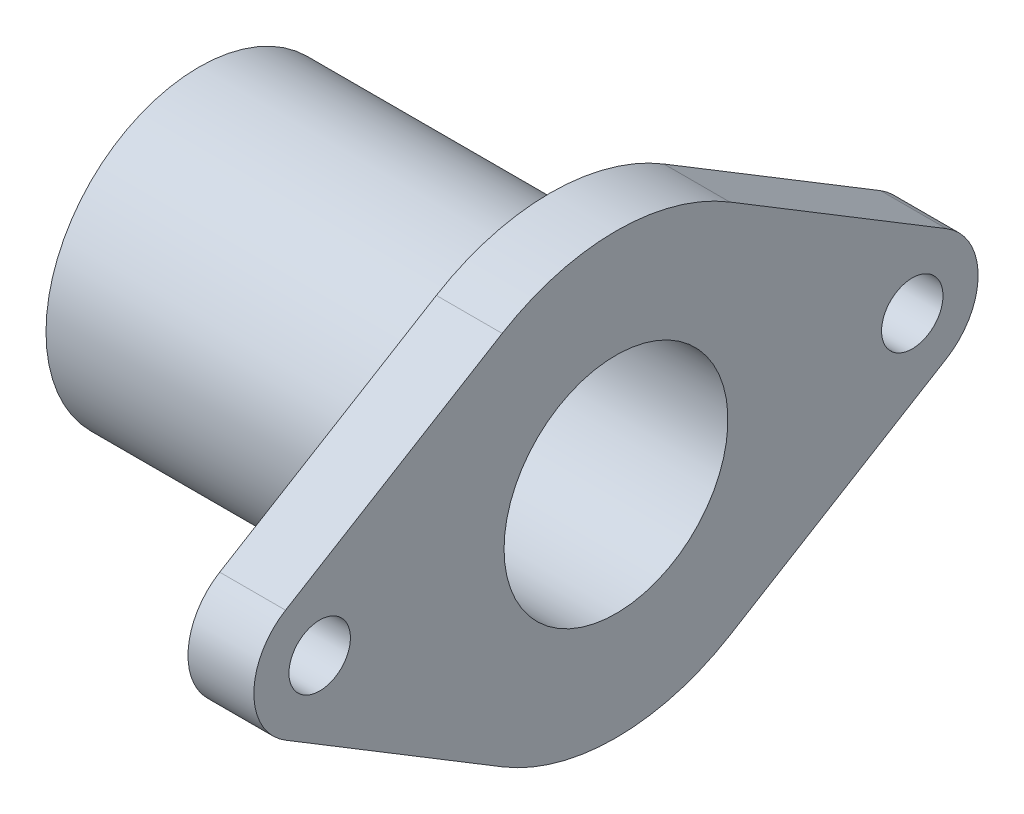
ISO-10303-21;
HEADER;
FILE_DESCRIPTION(('STEP AP214'),'2;1');
FILE_NAME('part.step','',(''),(''),'','','');
FILE_SCHEMA(('AUTOMOTIVE_DESIGN { 1 0 10303 214 1 1 1 1 }'));
ENDSEC;
DATA;
#1=APPLICATION_CONTEXT('core data for automotive mechanical design processes');
#2=APPLICATION_PROTOCOL_DEFINITION('international standard','automotive_design',2000,#1);
#3=PRODUCT_CONTEXT('',#1,'mechanical');
#4=PRODUCT('Part','Part','',(#3));
#5=PRODUCT_RELATED_PRODUCT_CATEGORY('part','',(#4));
#6=PRODUCT_DEFINITION_FORMATION('','',#4);
#7=PRODUCT_DEFINITION_CONTEXT('part definition',#1,'design');
#8=PRODUCT_DEFINITION('design','',#6,#7);
#9=PRODUCT_DEFINITION_SHAPE('','',#8);
#10=(LENGTH_UNIT() NAMED_UNIT(*) SI_UNIT(.MILLI.,.METRE.));
#11=(NAMED_UNIT(*) PLANE_ANGLE_UNIT() SI_UNIT($,.RADIAN.));
#12=(NAMED_UNIT(*) SI_UNIT($,.STERADIAN.) SOLID_ANGLE_UNIT());
#13=UNCERTAINTY_MEASURE_WITH_UNIT(LENGTH_MEASURE(1.E-05),#10,'distance_accuracy_value','');
#14=(GEOMETRIC_REPRESENTATION_CONTEXT(3) GLOBAL_UNCERTAINTY_ASSIGNED_CONTEXT((#13)) GLOBAL_UNIT_ASSIGNED_CONTEXT((#10,
#11,#12)) REPRESENTATION_CONTEXT('',''));
#15=CARTESIAN_POINT('',(0.,0.,0.));
#16=DIRECTION('',(0.,0.,1.));
#17=DIRECTION('',(1.,0.,0.));
#18=AXIS2_PLACEMENT_3D('',#15,#16,#17);
#19=CARTESIAN_POINT('',(0.,0.,0.));
#20=DIRECTION('',(1.,0.,0.));
#21=DIRECTION('',(0.,0.,-1.));
#22=AXIS2_PLACEMENT_3D('',#19,#20,#21);
#23=PLANE('',#22);
#24=CARTESIAN_POINT('',(0.,0.,0.));
#25=DIRECTION('',(1.,0.,0.));
#26=DIRECTION('',(0.,0.,-1.));
#27=AXIS2_PLACEMENT_3D('',#24,#25,#26);
#28=CIRCLE('',#27,41.85);
#29=CARTESIAN_POINT('',(0.,0.,-41.85));
#30=VERTEX_POINT('',#29);
#31=EDGE_CURVE('E251',#30,#30,#28,.T.);
#32=ORIENTED_EDGE('',*,*,#31,.T.);
#33=EDGE_LOOP('',(#32));
#34=FACE_BOUND('',#33,.T.);
#35=CARTESIAN_POINT('',(0.,0.,0.));
#36=DIRECTION('',(1.,0.,0.));
#37=DIRECTION('',(0.,0.,-1.));
#38=AXIS2_PLACEMENT_3D('',#35,#36,#37);
#39=CIRCLE('',#38,50.);
#40=CARTESIAN_POINT('',(0.,42.7533199282044,-25.9259259259259));
#41=VERTEX_POINT('',#40);
#42=CARTESIAN_POINT('',(0.,42.7533199282044,25.9259259259259));
#43=VERTEX_POINT('',#42);
#44=EDGE_CURVE('E153',#41,#43,#39,.T.);
#45=ORIENTED_EDGE('',*,*,#44,.F.);
#46=DIRECTION('',(0.,0.518518518518521,0.855066398564089));
#47=VECTOR('',#46,1.);
#48=CARTESIAN_POINT('',(0.,42.7533199282044,-25.9259259259259));
#49=LINE('',#48,#47);
#50=CARTESIAN_POINT('',(0.,12.8259959784613,-75.2777777777778));
#51=VERTEX_POINT('',#50);
#52=EDGE_CURVE('E104',#51,#41,#49,.T.);
#53=ORIENTED_EDGE('',*,*,#52,.F.);
#54=CARTESIAN_POINT('',(0.,0.,-67.5));
#55=DIRECTION('',(1.,0.,0.));
#56=DIRECTION('',(0.,0.,-1.));
#57=AXIS2_PLACEMENT_3D('',#54,#55,#56);
#58=CIRCLE('',#57,15.);
#59=CARTESIAN_POINT('',(0.,-12.8259959784613,-75.2777777777778));
#60=VERTEX_POINT('',#59);
#61=EDGE_CURVE('E98',#60,#51,#58,.T.);
#62=ORIENTED_EDGE('',*,*,#61,.F.);
#63=DIRECTION('',(0.,0.518518518518521,-0.855066398564089));
#64=VECTOR('',#63,1.);
#65=CARTESIAN_POINT('',(0.,-12.8259959784613,-75.2777777777778));
#66=LINE('',#65,#64);
#67=CARTESIAN_POINT('',(5.55111512312578E-13,-42.7533199282045,-25.9259259259259));
#68=VERTEX_POINT('',#67);
#69=EDGE_CURVE('E140',#68,#60,#66,.T.);
#70=ORIENTED_EDGE('',*,*,#69,.F.);
#71=CARTESIAN_POINT('',(0.,0.,0.));
#72=DIRECTION('',(1.,0.,0.));
#73=DIRECTION('',(0.,0.,-1.));
#74=AXIS2_PLACEMENT_3D('',#71,#72,#73);
#75=CIRCLE('',#74,50.);
#76=CARTESIAN_POINT('',(5.55111512312578E-13,-42.7533199282045,25.9259259259259));
#77=VERTEX_POINT('',#76);
#78=EDGE_CURVE('E167',#77,#68,#75,.T.);
#79=ORIENTED_EDGE('',*,*,#78,.F.);
#80=DIRECTION('',(0.,-0.518518518518521,-0.855066398564088));
#81=VECTOR('',#80,1.);
#82=CARTESIAN_POINT('',(0.,-12.8259959784613,75.2777777777778));
#83=LINE('',#82,#81);
#84=CARTESIAN_POINT('',(0.,-12.8259959784613,75.2777777777778));
#85=VERTEX_POINT('',#84);
#86=EDGE_CURVE('E164',#85,#77,#83,.T.);
#87=ORIENTED_EDGE('',*,*,#86,.F.);
#88=CARTESIAN_POINT('',(0.,0.,67.5));
#89=DIRECTION('',(1.,0.,0.));
#90=DIRECTION('',(0.,0.,-1.));
#91=AXIS2_PLACEMENT_3D('',#88,#89,#90);
#92=CIRCLE('',#91,15.);
#93=CARTESIAN_POINT('',(0.,12.8259959784613,75.2777777777778));
#94=VERTEX_POINT('',#93);
#95=EDGE_CURVE('E161',#94,#85,#92,.T.);
#96=ORIENTED_EDGE('',*,*,#95,.F.);
#97=DIRECTION('',(0.,-0.518518518518521,0.855066398564089));
#98=VECTOR('',#97,1.);
#99=CARTESIAN_POINT('',(0.,42.7533199282044,25.9259259259259));
#100=LINE('',#99,#98);
#101=EDGE_CURVE('E157',#43,#94,#100,.T.);
#102=ORIENTED_EDGE('',*,*,#101,.F.);
#103=EDGE_LOOP('',(#45,#53,#62,#70,#79,#87,#96,#102));
#104=FACE_BOUND('',#103,.T.);
#105=CARTESIAN_POINT('',(0.,0.,67.5));
#106=DIRECTION('',(-1.,0.,0.));
#107=DIRECTION('',(0.,0.,1.));
#108=AXIS2_PLACEMENT_3D('',#105,#106,#107);
#109=CIRCLE('',#108,7.);
#110=CARTESIAN_POINT('',(0.,0.,74.5));
#111=VERTEX_POINT('',#110);
#112=EDGE_CURVE('E220',#111,#111,#109,.T.);
#113=ORIENTED_EDGE('',*,*,#112,.F.);
#114=EDGE_LOOP('',(#113));
#115=FACE_BOUND('',#114,.T.);
#116=CARTESIAN_POINT('',(0.,0.,-67.5));
#117=DIRECTION('',(-1.,0.,0.));
#118=DIRECTION('',(0.,0.,1.));
#119=AXIS2_PLACEMENT_3D('',#116,#117,#118);
#120=CIRCLE('',#119,7.);
#121=CARTESIAN_POINT('',(0.,0.,-60.5));
#122=VERTEX_POINT('',#121);
#123=EDGE_CURVE('E228',#122,#122,#120,.T.);
#124=ORIENTED_EDGE('',*,*,#123,.F.);
#125=EDGE_LOOP('',(#124));
#126=FACE_BOUND('',#125,.T.);
#127=ADVANCED_FACE('F51',(#34,#104,#115,#126),#23,.F.);
#128=CARTESIAN_POINT('',(15.,0.,0.));
#129=DIRECTION('',(-1.,0.,0.));
#130=DIRECTION('',(0.,0.,1.));
#131=AXIS2_PLACEMENT_3D('',#128,#129,#130);
#132=CYLINDRICAL_SURFACE('',#131,50.);
#133=ORIENTED_EDGE('',*,*,#44,.T.);
#134=DIRECTION('',(-1.,0.,0.));
#135=VECTOR('',#134,1.);
#136=CARTESIAN_POINT('',(15.,42.7533199282044,25.9259259259259));
#137=LINE('',#136,#135);
#138=CARTESIAN_POINT('',(15.,42.7533199282044,25.9259259259259));
#139=VERTEX_POINT('',#138);
#140=EDGE_CURVE('E13',#139,#43,#137,.T.);
#141=ORIENTED_EDGE('',*,*,#140,.F.);
#142=CARTESIAN_POINT('',(15.,0.,0.));
#143=DIRECTION('',(1.,0.,0.));
#144=DIRECTION('',(0.,0.,-1.));
#145=AXIS2_PLACEMENT_3D('',#142,#143,#144);
#146=CIRCLE('',#145,50.);
#147=CARTESIAN_POINT('',(15.,42.7533199282044,-25.9259259259259));
#148=VERTEX_POINT('',#147);
#149=EDGE_CURVE('E176',#148,#139,#146,.T.);
#150=ORIENTED_EDGE('',*,*,#149,.F.);
#151=DIRECTION('',(-1.,0.,0.));
#152=VECTOR('',#151,1.);
#153=CARTESIAN_POINT('',(15.,42.7533199282044,-25.9259259259259));
#154=LINE('',#153,#152);
#155=EDGE_CURVE('E149',#148,#41,#154,.T.);
#156=ORIENTED_EDGE('',*,*,#155,.T.);
#157=EDGE_LOOP('',(#133,#141,#150,#156));
#158=FACE_BOUND('',#157,.T.);
#159=ADVANCED_FACE('F53',(#158),#132,.T.);
#160=CARTESIAN_POINT('',(15.,42.7533199282044,25.9259259259259));
#161=DIRECTION('',(0.,-0.855066398564093,-0.518518518518519));
#162=DIRECTION('',(0.,0.518518518518521,-0.855066398564089));
#163=AXIS2_PLACEMENT_3D('',#160,#161,#162);
#164=PLANE('',#163);
#165=ORIENTED_EDGE('',*,*,#101,.T.);
#166=DIRECTION('',(-1.,0.,0.));
#167=VECTOR('',#166,1.);
#168=CARTESIAN_POINT('',(15.,12.8259959784613,75.2777777777778));
#169=LINE('',#168,#167);
#170=CARTESIAN_POINT('',(15.,12.8259959784613,75.2777777777778));
#171=VERTEX_POINT('',#170);
#172=EDGE_CURVE('E61',#171,#94,#169,.T.);
#173=ORIENTED_EDGE('',*,*,#172,.F.);
#174=DIRECTION('',(0.,-0.518518518518521,0.855066398564089));
#175=VECTOR('',#174,1.);
#176=CARTESIAN_POINT('',(15.,42.7533199282044,25.9259259259259));
#177=LINE('',#176,#175);
#178=EDGE_CURVE('E112',#139,#171,#177,.T.);
#179=ORIENTED_EDGE('',*,*,#178,.F.);
#180=ORIENTED_EDGE('',*,*,#140,.T.);
#181=EDGE_LOOP('',(#165,#173,#179,#180));
#182=FACE_BOUND('',#181,.T.);
#183=ADVANCED_FACE('F274',(#182),#164,.F.);
#184=CARTESIAN_POINT('',(15.,0.,67.5));
#185=DIRECTION('',(-1.,0.,0.));
#186=DIRECTION('',(0.,0.,1.));
#187=AXIS2_PLACEMENT_3D('',#184,#185,#186);
#188=CYLINDRICAL_SURFACE('',#187,15.);
#189=ORIENTED_EDGE('',*,*,#95,.T.);
#190=DIRECTION('',(-1.,0.,0.));
#191=VECTOR('',#190,1.);
#192=CARTESIAN_POINT('',(15.,-12.8259959784613,75.2777777777778));
#193=LINE('',#192,#191);
#194=CARTESIAN_POINT('',(15.,-12.8259959784613,75.2777777777778));
#195=VERTEX_POINT('',#194);
#196=EDGE_CURVE('E187',#195,#85,#193,.T.);
#197=ORIENTED_EDGE('',*,*,#196,.F.);
#198=CARTESIAN_POINT('',(15.,0.,67.5));
#199=DIRECTION('',(1.,0.,0.));
#200=DIRECTION('',(0.,0.,-1.));
#201=AXIS2_PLACEMENT_3D('',#198,#199,#200);
#202=CIRCLE('',#201,15.);
#203=EDGE_CURVE('E197',#171,#195,#202,.T.);
#204=ORIENTED_EDGE('',*,*,#203,.F.);
#205=ORIENTED_EDGE('',*,*,#172,.T.);
#206=EDGE_LOOP('',(#189,#197,#204,#205));
#207=FACE_BOUND('',#206,.T.);
#208=ADVANCED_FACE('F195',(#207),#188,.T.);
#209=CARTESIAN_POINT('',(15.,-12.8259959784613,75.2777777777778));
#210=DIRECTION('',(0.,0.855066398564093,-0.518518518518519));
#211=DIRECTION('',(0.,0.518518518518521,0.855066398564089));
#212=AXIS2_PLACEMENT_3D('',#209,#210,#211);
#213=PLANE('',#212);
#214=ORIENTED_EDGE('',*,*,#86,.T.);
#215=DIRECTION('',(-1.,0.,0.));
#216=VECTOR('',#215,1.);
#217=CARTESIAN_POINT('',(15.0000000000006,-42.7533199282045,25.9259259259259));
#218=LINE('',#217,#216);
#219=CARTESIAN_POINT('',(15.0000000000006,-42.7533199282045,25.9259259259259));
#220=VERTEX_POINT('',#219);
#221=EDGE_CURVE('E183',#220,#77,#218,.T.);
#222=ORIENTED_EDGE('',*,*,#221,.F.);
#223=DIRECTION('',(0.,-0.518518518518521,-0.855066398564088));
#224=VECTOR('',#223,1.);
#225=CARTESIAN_POINT('',(15.,-12.8259959784613,75.2777777777778));
#226=LINE('',#225,#224);
#227=EDGE_CURVE('E210',#195,#220,#226,.T.);
#228=ORIENTED_EDGE('',*,*,#227,.F.);
#229=ORIENTED_EDGE('',*,*,#196,.T.);
#230=EDGE_LOOP('',(#214,#222,#228,#229));
#231=FACE_BOUND('',#230,.T.);
#232=ADVANCED_FACE('F205',(#231),#213,.F.);
#233=CARTESIAN_POINT('',(15.,0.,0.));
#234=DIRECTION('',(-1.,0.,0.));
#235=DIRECTION('',(0.,0.,1.));
#236=AXIS2_PLACEMENT_3D('',#233,#234,#235);
#237=CYLINDRICAL_SURFACE('',#236,50.);
#238=ORIENTED_EDGE('',*,*,#78,.T.);
#239=DIRECTION('',(-1.,0.,0.));
#240=VECTOR('',#239,1.);
#241=CARTESIAN_POINT('',(15.0000000000006,-42.7533199282045,-25.9259259259259));
#242=LINE('',#241,#240);
#243=CARTESIAN_POINT('',(15.0000000000006,-42.7533199282045,-25.9259259259259));
#244=VERTEX_POINT('',#243);
#245=EDGE_CURVE('E142',#244,#68,#242,.T.);
#246=ORIENTED_EDGE('',*,*,#245,.F.);
#247=CARTESIAN_POINT('',(15.,0.,0.));
#248=DIRECTION('',(1.,0.,0.));
#249=DIRECTION('',(0.,0.,-1.));
#250=AXIS2_PLACEMENT_3D('',#247,#248,#249);
#251=CIRCLE('',#250,50.);
#252=EDGE_CURVE('E131',#220,#244,#251,.T.);
#253=ORIENTED_EDGE('',*,*,#252,.F.);
#254=ORIENTED_EDGE('',*,*,#221,.T.);
#255=EDGE_LOOP('',(#238,#246,#253,#254));
#256=FACE_BOUND('',#255,.T.);
#257=ADVANCED_FACE('F208',(#256),#237,.T.);
#258=CARTESIAN_POINT('',(15.,-12.8259959784613,-75.2777777777778));
#259=DIRECTION('',(0.,0.855066398564093,0.518518518518519));
#260=DIRECTION('',(0.,-0.518518518518521,0.855066398564089));
#261=AXIS2_PLACEMENT_3D('',#258,#259,#260);
#262=PLANE('',#261);
#263=ORIENTED_EDGE('',*,*,#69,.T.);
#264=DIRECTION('',(-1.,0.,0.));
#265=VECTOR('',#264,1.);
#266=CARTESIAN_POINT('',(15.,-12.8259959784613,-75.2777777777778));
#267=LINE('',#266,#265);
#268=CARTESIAN_POINT('',(15.,-12.8259959784613,-75.2777777777778));
#269=VERTEX_POINT('',#268);
#270=EDGE_CURVE('E137',#269,#60,#267,.T.);
#271=ORIENTED_EDGE('',*,*,#270,.F.);
#272=DIRECTION('',(0.,0.518518518518521,-0.855066398564089));
#273=VECTOR('',#272,1.);
#274=CARTESIAN_POINT('',(15.,-12.8259959784613,-75.2777777777778));
#275=LINE('',#274,#273);
#276=EDGE_CURVE('E125',#244,#269,#275,.T.);
#277=ORIENTED_EDGE('',*,*,#276,.F.);
#278=ORIENTED_EDGE('',*,*,#245,.T.);
#279=EDGE_LOOP('',(#263,#271,#277,#278));
#280=FACE_BOUND('',#279,.T.);
#281=ADVANCED_FACE('F138',(#280),#262,.F.);
#282=CARTESIAN_POINT('',(15.,0.,-67.5));
#283=DIRECTION('',(-1.,0.,0.));
#284=DIRECTION('',(0.,0.,1.));
#285=AXIS2_PLACEMENT_3D('',#282,#283,#284);
#286=CYLINDRICAL_SURFACE('',#285,15.);
#287=ORIENTED_EDGE('',*,*,#61,.T.);
#288=DIRECTION('',(-1.,0.,0.));
#289=VECTOR('',#288,1.);
#290=CARTESIAN_POINT('',(15.,12.8259959784613,-75.2777777777778));
#291=LINE('',#290,#289);
#292=CARTESIAN_POINT('',(15.,12.8259959784613,-75.2777777777778));
#293=VERTEX_POINT('',#292);
#294=EDGE_CURVE('E143',#293,#51,#291,.T.);
#295=ORIENTED_EDGE('',*,*,#294,.F.);
#296=CARTESIAN_POINT('',(15.,0.,-67.5));
#297=DIRECTION('',(1.,0.,0.));
#298=DIRECTION('',(0.,0.,-1.));
#299=AXIS2_PLACEMENT_3D('',#296,#297,#298);
#300=CIRCLE('',#299,15.);
#301=EDGE_CURVE('E129',#269,#293,#300,.T.);
#302=ORIENTED_EDGE('',*,*,#301,.F.);
#303=ORIENTED_EDGE('',*,*,#270,.T.);
#304=EDGE_LOOP('',(#287,#295,#302,#303));
#305=FACE_BOUND('',#304,.T.);
#306=ADVANCED_FACE('F145',(#305),#286,.T.);
#307=CARTESIAN_POINT('',(15.,42.7533199282044,-25.9259259259259));
#308=DIRECTION('',(0.,-0.855066398564093,0.518518518518518));
#309=DIRECTION('',(0.,-0.518518518518521,-0.855066398564089));
#310=AXIS2_PLACEMENT_3D('',#307,#308,#309);
#311=PLANE('',#310);
#312=ORIENTED_EDGE('',*,*,#52,.T.);
#313=ORIENTED_EDGE('',*,*,#155,.F.);
#314=DIRECTION('',(0.,0.518518518518521,0.855066398564089));
#315=VECTOR('',#314,1.);
#316=CARTESIAN_POINT('',(15.,42.7533199282044,-25.9259259259259));
#317=LINE('',#316,#315);
#318=EDGE_CURVE('E69',#293,#148,#317,.T.);
#319=ORIENTED_EDGE('',*,*,#318,.F.);
#320=ORIENTED_EDGE('',*,*,#294,.T.);
#321=EDGE_LOOP('',(#312,#313,#319,#320));
#322=FACE_BOUND('',#321,.T.);
#323=ADVANCED_FACE('F279',(#322),#311,.F.);
#324=CARTESIAN_POINT('',(15.,0.,0.));
#325=DIRECTION('',(1.,0.,0.));
#326=DIRECTION('',(0.,0.,-1.));
#327=AXIS2_PLACEMENT_3D('',#324,#325,#326);
#328=PLANE('',#327);
#329=CARTESIAN_POINT('',(15.,0.,0.));
#330=DIRECTION('',(-1.,0.,0.));
#331=DIRECTION('',(0.,0.,1.));
#332=AXIS2_PLACEMENT_3D('',#329,#330,#331);
#333=CIRCLE('',#332,25.5);
#334=CARTESIAN_POINT('',(15.,0.,25.5));
#335=VERTEX_POINT('',#334);
#336=EDGE_CURVE('E232',#335,#335,#333,.T.);
#337=ORIENTED_EDGE('',*,*,#336,.T.);
#338=EDGE_LOOP('',(#337));
#339=FACE_BOUND('',#338,.T.);
#340=CARTESIAN_POINT('',(15.,0.,-67.5));
#341=DIRECTION('',(-1.,0.,0.));
#342=DIRECTION('',(0.,0.,1.));
#343=AXIS2_PLACEMENT_3D('',#340,#341,#342);
#344=CIRCLE('',#343,7.);
#345=CARTESIAN_POINT('',(15.,0.,-60.5));
#346=VERTEX_POINT('',#345);
#347=EDGE_CURVE('E224',#346,#346,#344,.T.);
#348=ORIENTED_EDGE('',*,*,#347,.T.);
#349=EDGE_LOOP('',(#348));
#350=FACE_BOUND('',#349,.T.);
#351=CARTESIAN_POINT('',(15.,0.,67.5));
#352=DIRECTION('',(-1.,0.,0.));
#353=DIRECTION('',(0.,0.,1.));
#354=AXIS2_PLACEMENT_3D('',#351,#352,#353);
#355=CIRCLE('',#354,7.);
#356=CARTESIAN_POINT('',(15.,0.,74.5));
#357=VERTEX_POINT('',#356);
#358=EDGE_CURVE('E158',#357,#357,#355,.T.);
#359=ORIENTED_EDGE('',*,*,#358,.T.);
#360=EDGE_LOOP('',(#359));
#361=FACE_BOUND('',#360,.T.);
#362=ORIENTED_EDGE('',*,*,#149,.T.);
#363=ORIENTED_EDGE('',*,*,#178,.T.);
#364=ORIENTED_EDGE('',*,*,#203,.T.);
#365=ORIENTED_EDGE('',*,*,#227,.T.);
#366=ORIENTED_EDGE('',*,*,#252,.T.);
#367=ORIENTED_EDGE('',*,*,#276,.T.);
#368=ORIENTED_EDGE('',*,*,#301,.T.);
#369=ORIENTED_EDGE('',*,*,#318,.T.);
#370=EDGE_LOOP('',(#362,#363,#364,#365,#366,#367,#368,#369));
#371=FACE_BOUND('',#370,.T.);
#372=ADVANCED_FACE('F127',(#339,#350,#361,#371),#328,.T.);
#373=CARTESIAN_POINT('',(15.,0.,67.5));
#374=DIRECTION('',(-1.,0.,0.));
#375=DIRECTION('',(0.,0.,1.));
#376=AXIS2_PLACEMENT_3D('',#373,#374,#375);
#377=CYLINDRICAL_SURFACE('',#376,7.);
#378=ORIENTED_EDGE('',*,*,#358,.F.);
#379=EDGE_LOOP('',(#378));
#380=FACE_BOUND('',#379,.T.);
#381=ORIENTED_EDGE('',*,*,#112,.T.);
#382=EDGE_LOOP('',(#381));
#383=FACE_BOUND('',#382,.T.);
#384=ADVANCED_FACE('F328',(#380,#383),#377,.F.);
#385=CARTESIAN_POINT('',(15.,0.,-67.5));
#386=DIRECTION('',(-1.,0.,0.));
#387=DIRECTION('',(0.,0.,1.));
#388=AXIS2_PLACEMENT_3D('',#385,#386,#387);
#389=CYLINDRICAL_SURFACE('',#388,7.);
#390=ORIENTED_EDGE('',*,*,#347,.F.);
#391=EDGE_LOOP('',(#390));
#392=FACE_BOUND('',#391,.T.);
#393=ORIENTED_EDGE('',*,*,#123,.T.);
#394=EDGE_LOOP('',(#393));
#395=FACE_BOUND('',#394,.T.);
#396=ADVANCED_FACE('F335',(#392,#395),#389,.F.);
#397=CARTESIAN_POINT('',(15.,0.,0.));
#398=DIRECTION('',(-1.,0.,0.));
#399=DIRECTION('',(0.,0.,1.));
#400=AXIS2_PLACEMENT_3D('',#397,#398,#399);
#401=CYLINDRICAL_SURFACE('',#400,25.5);
#402=ORIENTED_EDGE('',*,*,#336,.F.);
#403=EDGE_LOOP('',(#402));
#404=FACE_BOUND('',#403,.T.);
#405=CARTESIAN_POINT('',(-80.,0.,0.));
#406=DIRECTION('',(-1.,0.,0.));
#407=DIRECTION('',(0.,0.,1.));
#408=AXIS2_PLACEMENT_3D('',#405,#406,#407);
#409=CIRCLE('',#408,25.5);
#410=CARTESIAN_POINT('',(-80.,0.,25.5));
#411=VERTEX_POINT('',#410);
#412=EDGE_CURVE('E243',#411,#411,#409,.T.);
#413=ORIENTED_EDGE('',*,*,#412,.T.);
#414=EDGE_LOOP('',(#413));
#415=FACE_BOUND('',#414,.T.);
#416=ADVANCED_FACE('F342',(#404,#415),#401,.F.);
#417=CARTESIAN_POINT('',(-80.,0.,0.));
#418=DIRECTION('',(-1.,0.,0.));
#419=DIRECTION('',(0.,0.,1.));
#420=AXIS2_PLACEMENT_3D('',#417,#418,#419);
#421=PLANE('',#420);
#422=CARTESIAN_POINT('',(-80.,0.,0.));
#423=DIRECTION('',(-1.,0.,0.));
#424=DIRECTION('',(0.,0.,1.));
#425=AXIS2_PLACEMENT_3D('',#422,#423,#424);
#426=CIRCLE('',#425,34.85);
#427=CARTESIAN_POINT('',(-80.,0.,34.85));
#428=VERTEX_POINT('',#427);
#429=EDGE_CURVE('E239',#428,#428,#426,.T.);
#430=ORIENTED_EDGE('',*,*,#429,.T.);
#431=EDGE_LOOP('',(#430));
#432=FACE_BOUND('',#431,.T.);
#433=ORIENTED_EDGE('',*,*,#412,.F.);
#434=EDGE_LOOP('',(#433));
#435=FACE_BOUND('',#434,.T.);
#436=ADVANCED_FACE('F265',(#432,#435),#421,.T.);
#437=CARTESIAN_POINT('',(-80.,0.,0.));
#438=DIRECTION('',(1.,0.,0.));
#439=DIRECTION('',(0.,0.,-1.));
#440=AXIS2_PLACEMENT_3D('',#437,#438,#439);
#441=CYLINDRICAL_SURFACE('',#440,34.85);
#442=CARTESIAN_POINT('',(-5.,0.,0.));
#443=DIRECTION('',(1.,0.,0.));
#444=DIRECTION('',(0.,0.,-1.));
#445=AXIS2_PLACEMENT_3D('',#442,#443,#444);
#446=CIRCLE('',#445,34.85);
#447=CARTESIAN_POINT('',(-5.,0.,-34.85));
#448=VERTEX_POINT('',#447);
#449=EDGE_CURVE('E247',#448,#448,#446,.T.);
#450=ORIENTED_EDGE('',*,*,#449,.F.);
#451=EDGE_LOOP('',(#450));
#452=FACE_BOUND('',#451,.T.);
#453=ORIENTED_EDGE('',*,*,#429,.F.);
#454=EDGE_LOOP('',(#453));
#455=FACE_BOUND('',#454,.T.);
#456=ADVANCED_FACE('F259',(#452,#455),#441,.T.);
#457=CARTESIAN_POINT('',(0.,0.,0.));
#458=DIRECTION('',(1.,0.,0.));
#459=DIRECTION('',(0.,0.,-1.));
#460=AXIS2_PLACEMENT_3D('',#457,#458,#459);
#461=CONICAL_SURFACE('',#460,41.85,0.950546840812075);
#462=ORIENTED_EDGE('',*,*,#449,.T.);
#463=EDGE_LOOP('',(#462));
#464=FACE_BOUND('',#463,.T.);
#465=ORIENTED_EDGE('',*,*,#31,.F.);
#466=EDGE_LOOP('',(#465));
#467=FACE_BOUND('',#466,.T.);
#468=ADVANCED_FACE('F257',(#464,#467),#461,.T.);
#469=CLOSED_SHELL('',(#127,#159,#183,#208,#232,#257,#281,#306,#323,#372,#384,#396,#416,#436,
#456,#468));
#470=MANIFOLD_SOLID_BREP('B2',#469);
#471=ADVANCED_BREP_SHAPE_REPRESENTATION('',(#18,#470),#14);
#472=SHAPE_DEFINITION_REPRESENTATION(#9,#471);
ENDSEC;
END-ISO-10303-21;
